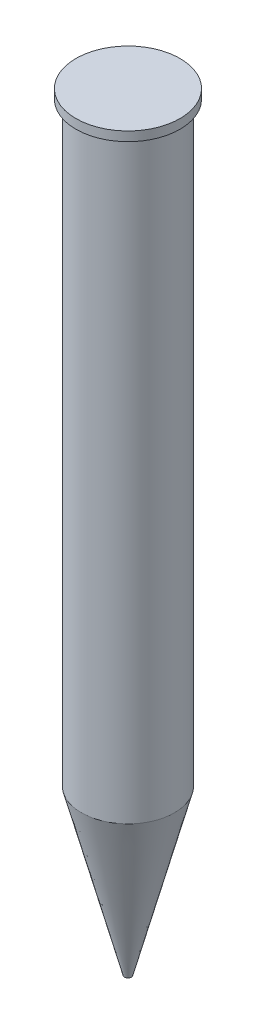
ISO-10303-21;
HEADER;
FILE_DESCRIPTION(('STEP AP214'),'2;1');
FILE_NAME('part.step','',(''),(''),'','','');
FILE_SCHEMA(('AUTOMOTIVE_DESIGN { 1 0 10303 214 1 1 1 1 }'));
ENDSEC;
DATA;
#1=APPLICATION_CONTEXT('core data for automotive mechanical design processes');
#2=APPLICATION_PROTOCOL_DEFINITION('international standard','automotive_design',2000,#1);
#3=PRODUCT_CONTEXT('',#1,'mechanical');
#4=PRODUCT('Part','Part','',(#3));
#5=PRODUCT_RELATED_PRODUCT_CATEGORY('part','',(#4));
#6=PRODUCT_DEFINITION_FORMATION('','',#4);
#7=PRODUCT_DEFINITION_CONTEXT('part definition',#1,'design');
#8=PRODUCT_DEFINITION('design','',#6,#7);
#9=PRODUCT_DEFINITION_SHAPE('','',#8);
#10=(LENGTH_UNIT() NAMED_UNIT(*) SI_UNIT(.MILLI.,.METRE.));
#11=(NAMED_UNIT(*) PLANE_ANGLE_UNIT() SI_UNIT($,.RADIAN.));
#12=(NAMED_UNIT(*) SI_UNIT($,.STERADIAN.) SOLID_ANGLE_UNIT());
#13=UNCERTAINTY_MEASURE_WITH_UNIT(LENGTH_MEASURE(1.E-05),#10,'distance_accuracy_value','');
#14=(GEOMETRIC_REPRESENTATION_CONTEXT(3) GLOBAL_UNCERTAINTY_ASSIGNED_CONTEXT((#13)) GLOBAL_UNIT_ASSIGNED_CONTEXT((#10,
#11,#12)) REPRESENTATION_CONTEXT('',''));
#15=CARTESIAN_POINT('',(0.,0.,0.));
#16=DIRECTION('',(0.,0.,1.));
#17=DIRECTION('',(1.,0.,0.));
#18=AXIS2_PLACEMENT_3D('',#15,#16,#17);
#19=CARTESIAN_POINT('',(0.,812.8,0.));
#20=DIRECTION('',(0.,-1.,0.));
#21=DIRECTION('',(0.,0.,-1.));
#22=AXIS2_PLACEMENT_3D('',#19,#20,#21);
#23=CYLINDRICAL_SURFACE('',#22,63.5);
#24=CARTESIAN_POINT('',(0.,812.8,0.));
#25=DIRECTION('',(0.,1.,0.));
#26=DIRECTION('',(0.,0.,1.));
#27=AXIS2_PLACEMENT_3D('',#24,#25,#26);
#28=CIRCLE('',#27,63.5);
#29=CARTESIAN_POINT('',(0.,812.8,63.5));
#30=VERTEX_POINT('',#29);
#31=EDGE_CURVE('E10',#30,#30,#28,.T.);
#32=ORIENTED_EDGE('',*,*,#31,.F.);
#33=EDGE_LOOP('',(#32));
#34=FACE_BOUND('',#33,.T.);
#35=CARTESIAN_POINT('',(0.,0.,0.));
#36=DIRECTION('',(0.,1.,0.));
#37=DIRECTION('',(0.,0.,1.));
#38=AXIS2_PLACEMENT_3D('',#35,#36,#37);
#39=CIRCLE('',#38,63.5);
#40=CARTESIAN_POINT('',(0.,0.,63.5));
#41=VERTEX_POINT('',#40);
#42=EDGE_CURVE('E49',#41,#41,#39,.T.);
#43=ORIENTED_EDGE('',*,*,#42,.T.);
#44=EDGE_LOOP('',(#43));
#45=FACE_BOUND('',#44,.T.);
#46=ADVANCED_FACE('F34',(#34,#45),#23,.T.);
#47=CARTESIAN_POINT('',(0.,825.5,0.));
#48=DIRECTION('',(0.,-1.,0.));
#49=DIRECTION('',(0.,0.,-1.));
#50=AXIS2_PLACEMENT_3D('',#47,#48,#49);
#51=CYLINDRICAL_SURFACE('',#50,71.1285559506139);
#52=CARTESIAN_POINT('',(0.,825.5,0.));
#53=DIRECTION('',(0.,1.,0.));
#54=DIRECTION('',(0.,0.,1.));
#55=AXIS2_PLACEMENT_3D('',#52,#53,#54);
#56=CIRCLE('',#55,71.1285559506139);
#57=CARTESIAN_POINT('',(0.,825.5,71.1285559506139));
#58=VERTEX_POINT('',#57);
#59=EDGE_CURVE('E40',#58,#58,#56,.T.);
#60=ORIENTED_EDGE('',*,*,#59,.F.);
#61=EDGE_LOOP('',(#60));
#62=FACE_BOUND('',#61,.T.);
#63=CARTESIAN_POINT('',(0.,812.8,0.));
#64=DIRECTION('',(0.,1.,0.));
#65=DIRECTION('',(0.,0.,1.));
#66=AXIS2_PLACEMENT_3D('',#63,#64,#65);
#67=CIRCLE('',#66,71.1285559506139);
#68=CARTESIAN_POINT('',(0.,812.8,71.1285559506139));
#69=VERTEX_POINT('',#68);
#70=EDGE_CURVE('E44',#69,#69,#67,.T.);
#71=ORIENTED_EDGE('',*,*,#70,.T.);
#72=EDGE_LOOP('',(#71));
#73=FACE_BOUND('',#72,.T.);
#74=ADVANCED_FACE('F69',(#62,#73),#51,.T.);
#75=CARTESIAN_POINT('',(0.,825.5,0.));
#76=DIRECTION('',(0.,1.,0.));
#77=DIRECTION('',(0.,0.,1.));
#78=AXIS2_PLACEMENT_3D('',#75,#76,#77);
#79=PLANE('',#78);
#80=ORIENTED_EDGE('',*,*,#59,.T.);
#81=EDGE_LOOP('',(#80));
#82=FACE_BOUND('',#81,.T.);
#83=ADVANCED_FACE('F74',(#82),#79,.T.);
#84=CARTESIAN_POINT('',(0.,812.8,0.));
#85=DIRECTION('',(0.,1.,0.));
#86=DIRECTION('',(0.,0.,1.));
#87=AXIS2_PLACEMENT_3D('',#84,#85,#86);
#88=PLANE('',#87);
#89=ORIENTED_EDGE('',*,*,#31,.T.);
#90=EDGE_LOOP('',(#89));
#91=FACE_BOUND('',#90,.T.);
#92=ORIENTED_EDGE('',*,*,#70,.F.);
#93=EDGE_LOOP('',(#92));
#94=FACE_BOUND('',#93,.T.);
#95=ADVANCED_FACE('F66',(#91,#94),#88,.F.);
#96=CARTESIAN_POINT('',(0.,0.,0.));
#97=DIRECTION('',(0.,1.,0.));
#98=DIRECTION('',(0.,0.,1.));
#99=AXIS2_PLACEMENT_3D('',#96,#97,#98);
#100=CONICAL_SURFACE('',#99,63.5,0.256817201872613);
#101=CARTESIAN_POINT('',(0.,-223.940998136545,0.));
#102=DIRECTION('',(0.,1.,0.));
#103=DIRECTION('',(0.,0.,1.));
#104=AXIS2_PLACEMENT_3D('',#101,#102,#103);
#105=CIRCLE('',#104,4.68942647744225);
#106=CARTESIAN_POINT('',(0.,-223.940998136545,4.68942647744226));
#107=VERTEX_POINT('',#106);
#108=EDGE_CURVE('E53',#107,#107,#105,.T.);
#109=CARTESIAN_POINT('',(0.,-223.940998136545,4.68942647744226));
#110=CARTESIAN_POINT('',(0.,-221.608279405956,5.30203661830224));
#111=CARTESIAN_POINT('',(0.,-219.275560675367,5.91464675916222));
#112=CARTESIAN_POINT('',(0.,-214.610123214189,7.13986704088217));
#113=CARTESIAN_POINT('',(0.,-212.2774044836,7.75247718174214));
#114=CARTESIAN_POINT('',(0.,-207.611967022422,8.97769746346209));
#115=CARTESIAN_POINT('',(0.,-205.279248291833,9.59030760432207));
#116=CARTESIAN_POINT('',(0.,-200.613810830655,10.815527886042));
#117=CARTESIAN_POINT('',(0.,-198.281092100066,11.428138026902));
#118=CARTESIAN_POINT('',(0.,-193.615654638888,12.653358308622));
#119=CARTESIAN_POINT('',(0.,-191.282935908299,13.2659684494819));
#120=CARTESIAN_POINT('',(0.,-186.617498447121,14.4911887312019));
#121=CARTESIAN_POINT('',(0.,-184.284779716532,15.1037988720619));
#122=CARTESIAN_POINT('',(0.,-179.619342255354,16.3290191537818));
#123=CARTESIAN_POINT('',(0.,-177.286623524765,16.9416292946418));
#124=CARTESIAN_POINT('',(0.,-172.621186063587,18.1668495763617));
#125=CARTESIAN_POINT('',(0.,-170.288467332998,18.7794597172217));
#126=CARTESIAN_POINT('',(0.,-165.62302987182,20.0046799989417));
#127=CARTESIAN_POINT('',(0.,-163.290311141231,20.6172901398016));
#128=CARTESIAN_POINT('',(0.,-158.624873680053,21.8425104215216));
#129=CARTESIAN_POINT('',(0.,-156.292154949464,22.4551205623816));
#130=CARTESIAN_POINT('',(0.,-151.626717488286,23.6803408441015));
#131=CARTESIAN_POINT('',(0.,-149.293998757697,24.2929509849615));
#132=CARTESIAN_POINT('',(0.,-144.628561296519,25.5181712666815));
#133=CARTESIAN_POINT('',(0.,-142.29584256593,26.1307814075414));
#134=CARTESIAN_POINT('',(0.,-137.630405104752,27.3560016892614));
#135=CARTESIAN_POINT('',(0.,-135.297686374163,27.9686118301214));
#136=CARTESIAN_POINT('',(0.,-130.632248912984,29.1938321118413));
#137=CARTESIAN_POINT('',(0.,-128.299530182396,29.8064422527013));
#138=CARTESIAN_POINT('',(0.,-123.634092721217,31.0316625344213));
#139=CARTESIAN_POINT('',(0.,-121.301373990628,31.6442726752812));
#140=CARTESIAN_POINT('',(0.,-116.63593652945,32.8694929570012));
#141=CARTESIAN_POINT('',(0.,-114.303217798861,33.4821030978612));
#142=CARTESIAN_POINT('',(0.,-109.637780337683,34.7073233795811));
#143=CARTESIAN_POINT('',(0.,-107.305061607094,35.3199335204411));
#144=CARTESIAN_POINT('',(0.,-102.639624145916,36.545153802161));
#145=CARTESIAN_POINT('',(0.,-100.306905415327,37.157763943021));
#146=CARTESIAN_POINT('',(0.,-95.6414679541494,38.382984224741));
#147=CARTESIAN_POINT('',(0.,-93.3087492235604,38.9955943656009));
#148=CARTESIAN_POINT('',(0.,-88.6433117623824,40.2208146473209));
#149=CARTESIAN_POINT('',(0.,-86.3105930317933,40.8334247881809));
#150=CARTESIAN_POINT('',(0.,-81.6451555706153,42.0586450699008));
#151=CARTESIAN_POINT('',(0.,-79.3124368400263,42.6712552107608));
#152=CARTESIAN_POINT('',(0.,-74.6469993788483,43.8964754924808));
#153=CARTESIAN_POINT('',(0.,-72.3142806482593,44.5090856333407));
#154=CARTESIAN_POINT('',(0.,-67.6488431870813,45.7343059150607));
#155=CARTESIAN_POINT('',(0.,-65.3161244564922,46.3469160559207));
#156=CARTESIAN_POINT('',(0.,-60.6506869953142,47.5721363376406));
#157=CARTESIAN_POINT('',(0.,-58.3179682647252,48.1847464785006));
#158=CARTESIAN_POINT('',(0.,-53.6525308035472,49.4099667602205));
#159=CARTESIAN_POINT('',(0.,-51.3198120729582,50.0225769010805));
#160=CARTESIAN_POINT('',(0.,-46.6543746117802,51.2477971828005));
#161=CARTESIAN_POINT('',(0.,-44.3216558811912,51.8604073236604));
#162=CARTESIAN_POINT('',(0.,-39.6562184200132,53.0856276053804));
#163=CARTESIAN_POINT('',(0.,-37.3234996894242,53.6982377462404));
#164=CARTESIAN_POINT('',(0.,-32.6580622282461,54.9234580279603));
#165=CARTESIAN_POINT('',(0.,-30.3253434976571,55.5360681688203));
#166=CARTESIAN_POINT('',(0.,-25.6599060364791,56.7612884505403));
#167=CARTESIAN_POINT('',(0.,-23.3271873058901,57.3738985914002));
#168=CARTESIAN_POINT('',(0.,-18.6617498447121,58.5991188731202));
#169=CARTESIAN_POINT('',(0.,-16.3290311141231,59.2117290139802));
#170=CARTESIAN_POINT('',(0.,-11.663593652945,60.4369492957001));
#171=CARTESIAN_POINT('',(0.,-9.33087492235603,61.0495594365601));
#172=CARTESIAN_POINT('',(0.,-4.66543746117802,62.2747797182801));
#173=CARTESIAN_POINT('',(0.,-2.33271873058901,62.88738985914));
#174=CARTESIAN_POINT('',(0.,0.,63.5));
#175=B_SPLINE_CURVE_WITH_KNOTS('',3,(#109,#110,#111,#112,#113,#114,#115,#116,#117,#118,#119,
#120,#121,#122,#123,#124,#125,#126,#127,#128,#129,#130,#131,#132,#133,#134,#135,#136,#137,#138,
#139,#140,#141,#142,#143,#144,#145,#146,#147,#148,#149,#150,#151,#152,#153,#154,#155,#156,#157,
#158,#159,#160,#161,#162,#163,#164,#165,#166,#167,#168,#169,#170,#171,#172,#173,#174),
.UNSPECIFIED.,.F.,.F.,(4,2,2,2,2,2,2,2,2,2,2,2,2,2,2,2,2,2,2,2,2,2,2,2,2,2,2,2,2,2,2,2,4),(0.,
7.23545511675164,14.4709102335033,21.7063653502549,28.9418204670066,36.1772755837582,
43.4127307005099,50.6481858172615,57.8836409340131,65.1190960507648,72.3545511675164,
79.5900062842681,86.8254614010197,94.0609165177713,101.296371634523,108.531826751275,
115.767281868026,123.002736984778,130.23819210153,137.473647218281,144.709102335033,
151.944557451784,159.180012568536,166.415467685288,173.650922802039,180.886377918791,
188.121833035543,195.357288152294,202.592743269046,209.828198385798,217.063653502549,
224.299108619301,231.534563736053),.UNSPECIFIED.);
#176=EDGE_CURVE('BSEAM57',#107,#41,#175,.T.);
#177=ORIENTED_EDGE('',*,*,#108,.T.);
#178=ORIENTED_EDGE('',*,*,#42,.F.);
#179=ORIENTED_EDGE('',*,*,#176,.T.);
#180=ORIENTED_EDGE('',*,*,#176,.F.);
#181=EDGE_LOOP('',(#177,#179,#178,#180));
#182=FACE_BOUND('',#181,.T.);
#183=ADVANCED_FACE('F57',(#182),#100,.T.);
#184=CARTESIAN_POINT('',(0.,-223.940998136545,0.));
#185=DIRECTION('',(0.,-1.,0.));
#186=DIRECTION('',(0.,0.,-1.));
#187=AXIS2_PLACEMENT_3D('',#184,#185,#186);
#188=PLANE('',#187);
#189=ORIENTED_EDGE('',*,*,#108,.F.);
#190=EDGE_LOOP('',(#189));
#191=FACE_BOUND('',#190,.T.);
#192=ADVANCED_FACE('F60',(#191),#188,.T.);
#193=CLOSED_SHELL('',(#46,#74,#83,#95,#183,#192));
#194=MANIFOLD_SOLID_BREP('B2',#193);
#195=ADVANCED_BREP_SHAPE_REPRESENTATION('',(#18,#194),#14);
#196=SHAPE_DEFINITION_REPRESENTATION(#9,#195);
ENDSEC;
END-ISO-10303-21;
